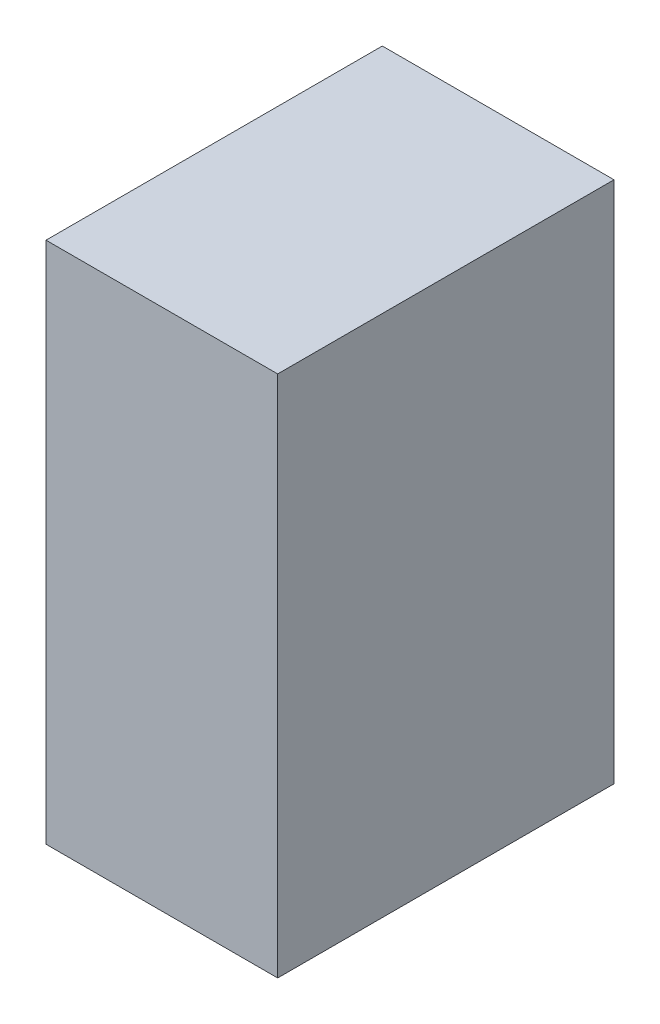
ISO-10303-21;
HEADER;
FILE_DESCRIPTION(('STEP AP214'),'2;1');
FILE_NAME('part.step','',(''),(''),'','','');
FILE_SCHEMA(('AUTOMOTIVE_DESIGN { 1 0 10303 214 1 1 1 1 }'));
ENDSEC;
DATA;
#1=APPLICATION_CONTEXT('core data for automotive mechanical design processes');
#2=APPLICATION_PROTOCOL_DEFINITION('international standard','automotive_design',2000,#1);
#3=PRODUCT_CONTEXT('',#1,'mechanical');
#4=PRODUCT('Part','Part','',(#3));
#5=PRODUCT_RELATED_PRODUCT_CATEGORY('part','',(#4));
#6=PRODUCT_DEFINITION_FORMATION('','',#4);
#7=PRODUCT_DEFINITION_CONTEXT('part definition',#1,'design');
#8=PRODUCT_DEFINITION('design','',#6,#7);
#9=PRODUCT_DEFINITION_SHAPE('','',#8);
#10=(LENGTH_UNIT() NAMED_UNIT(*) SI_UNIT(.MILLI.,.METRE.));
#11=(NAMED_UNIT(*) PLANE_ANGLE_UNIT() SI_UNIT($,.RADIAN.));
#12=(NAMED_UNIT(*) SI_UNIT($,.STERADIAN.) SOLID_ANGLE_UNIT());
#13=UNCERTAINTY_MEASURE_WITH_UNIT(LENGTH_MEASURE(1.E-05),#10,'distance_accuracy_value','');
#14=(GEOMETRIC_REPRESENTATION_CONTEXT(3) GLOBAL_UNCERTAINTY_ASSIGNED_CONTEXT((#13)) GLOBAL_UNIT_ASSIGNED_CONTEXT((#10,
#11,#12)) REPRESENTATION_CONTEXT('',''));
#15=CARTESIAN_POINT('',(0.,0.,0.));
#16=DIRECTION('',(0.,0.,1.));
#17=DIRECTION('',(1.,0.,0.));
#18=AXIS2_PLACEMENT_3D('',#15,#16,#17);
#19=CARTESIAN_POINT('',(19.685,-44.45,28.575));
#20=DIRECTION('',(1.,0.,0.));
#21=DIRECTION('',(0.,0.,-1.));
#22=AXIS2_PLACEMENT_3D('',#19,#20,#21);
#23=PLANE('',#22);
#24=DIRECTION('',(0.,1.,0.));
#25=VECTOR('',#24,1.);
#26=CARTESIAN_POINT('',(19.685,-44.45,-28.575));
#27=LINE('',#26,#25);
#28=CARTESIAN_POINT('',(19.685,-44.45,-28.575));
#29=VERTEX_POINT('',#28);
#30=CARTESIAN_POINT('',(19.685,44.45,-28.575));
#31=VERTEX_POINT('',#30);
#32=EDGE_CURVE('E40',#29,#31,#27,.T.);
#33=ORIENTED_EDGE('',*,*,#32,.T.);
#34=DIRECTION('',(0.,0.,-1.));
#35=VECTOR('',#34,1.);
#36=CARTESIAN_POINT('',(19.685,44.45,28.575));
#37=LINE('',#36,#35);
#38=CARTESIAN_POINT('',(19.685,44.45,28.575));
#39=VERTEX_POINT('',#38);
#40=EDGE_CURVE('E77',#39,#31,#37,.T.);
#41=ORIENTED_EDGE('',*,*,#40,.F.);
#42=DIRECTION('',(0.,1.,0.));
#43=VECTOR('',#42,1.);
#44=CARTESIAN_POINT('',(19.685,-44.45,28.575));
#45=LINE('',#44,#43);
#46=CARTESIAN_POINT('',(19.685,-44.45,28.575));
#47=VERTEX_POINT('',#46);
#48=EDGE_CURVE('E11',#47,#39,#45,.T.);
#49=ORIENTED_EDGE('',*,*,#48,.F.);
#50=DIRECTION('',(0.,0.,-1.));
#51=VECTOR('',#50,1.);
#52=CARTESIAN_POINT('',(19.685,-44.45,28.575));
#53=LINE('',#52,#51);
#54=EDGE_CURVE('E78',#47,#29,#53,.T.);
#55=ORIENTED_EDGE('',*,*,#54,.T.);
#56=EDGE_LOOP('',(#33,#41,#49,#55));
#57=FACE_BOUND('',#56,.T.);
#58=ADVANCED_FACE('F37',(#57),#23,.T.);
#59=CARTESIAN_POINT('',(-19.685,-44.45,28.575));
#60=DIRECTION('',(0.,0.,1.));
#61=DIRECTION('',(1.,0.,0.));
#62=AXIS2_PLACEMENT_3D('',#59,#60,#61);
#63=PLANE('',#62);
#64=ORIENTED_EDGE('',*,*,#48,.T.);
#65=DIRECTION('',(1.,0.,0.));
#66=VECTOR('',#65,1.);
#67=CARTESIAN_POINT('',(-19.685,44.45,28.575));
#68=LINE('',#67,#66);
#69=CARTESIAN_POINT('',(-19.685,44.45,28.575));
#70=VERTEX_POINT('',#69);
#71=EDGE_CURVE('E94',#70,#39,#68,.T.);
#72=ORIENTED_EDGE('',*,*,#71,.F.);
#73=DIRECTION('',(0.,1.,0.));
#74=VECTOR('',#73,1.);
#75=CARTESIAN_POINT('',(-19.685,-44.45,28.575));
#76=LINE('',#75,#74);
#77=CARTESIAN_POINT('',(-19.685,-44.45,28.575));
#78=VERTEX_POINT('',#77);
#79=EDGE_CURVE('E45',#78,#70,#76,.T.);
#80=ORIENTED_EDGE('',*,*,#79,.F.);
#81=DIRECTION('',(1.,0.,0.));
#82=VECTOR('',#81,1.);
#83=CARTESIAN_POINT('',(-19.685,-44.45,28.575));
#84=LINE('',#83,#82);
#85=EDGE_CURVE('E83',#78,#47,#84,.T.);
#86=ORIENTED_EDGE('',*,*,#85,.T.);
#87=EDGE_LOOP('',(#64,#72,#80,#86));
#88=FACE_BOUND('',#87,.T.);
#89=ADVANCED_FACE('F109',(#88),#63,.T.);
#90=CARTESIAN_POINT('',(-19.685,-44.45,28.575));
#91=DIRECTION('',(-1.,0.,0.));
#92=DIRECTION('',(0.,0.,1.));
#93=AXIS2_PLACEMENT_3D('',#90,#91,#92);
#94=PLANE('',#93);
#95=ORIENTED_EDGE('',*,*,#79,.T.);
#96=DIRECTION('',(0.,0.,1.));
#97=VECTOR('',#96,1.);
#98=CARTESIAN_POINT('',(-19.685,44.45,28.575));
#99=LINE('',#98,#97);
#100=CARTESIAN_POINT('',(-19.685,44.45,-28.575));
#101=VERTEX_POINT('',#100);
#102=EDGE_CURVE('E90',#101,#70,#99,.T.);
#103=ORIENTED_EDGE('',*,*,#102,.F.);
#104=DIRECTION('',(0.,1.,0.));
#105=VECTOR('',#104,1.);
#106=CARTESIAN_POINT('',(-19.685,-44.45,-28.575));
#107=LINE('',#106,#105);
#108=CARTESIAN_POINT('',(-19.685,-44.45,-28.575));
#109=VERTEX_POINT('',#108);
#110=EDGE_CURVE('E82',#109,#101,#107,.T.);
#111=ORIENTED_EDGE('',*,*,#110,.F.);
#112=DIRECTION('',(0.,0.,1.));
#113=VECTOR('',#112,1.);
#114=CARTESIAN_POINT('',(-19.685,-44.45,28.575));
#115=LINE('',#114,#113);
#116=EDGE_CURVE('E102',#109,#78,#115,.T.);
#117=ORIENTED_EDGE('',*,*,#116,.T.);
#118=EDGE_LOOP('',(#95,#103,#111,#117));
#119=FACE_BOUND('',#118,.T.);
#120=ADVANCED_FACE('F106',(#119),#94,.T.);
#121=CARTESIAN_POINT('',(-19.685,-44.45,-28.575));
#122=DIRECTION('',(0.,0.,-1.));
#123=DIRECTION('',(-1.,0.,0.));
#124=AXIS2_PLACEMENT_3D('',#121,#122,#123);
#125=PLANE('',#124);
#126=ORIENTED_EDGE('',*,*,#110,.T.);
#127=DIRECTION('',(-1.,0.,0.));
#128=VECTOR('',#127,1.);
#129=CARTESIAN_POINT('',(-19.685,44.45,-28.575));
#130=LINE('',#129,#128);
#131=EDGE_CURVE('E85',#31,#101,#130,.T.);
#132=ORIENTED_EDGE('',*,*,#131,.F.);
#133=ORIENTED_EDGE('',*,*,#32,.F.);
#134=DIRECTION('',(-1.,0.,0.));
#135=VECTOR('',#134,1.);
#136=CARTESIAN_POINT('',(-19.685,-44.45,-28.575));
#137=LINE('',#136,#135);
#138=EDGE_CURVE('E100',#29,#109,#137,.T.);
#139=ORIENTED_EDGE('',*,*,#138,.T.);
#140=EDGE_LOOP('',(#126,#132,#133,#139));
#141=FACE_BOUND('',#140,.T.);
#142=ADVANCED_FACE('F86',(#141),#125,.T.);
#143=CARTESIAN_POINT('',(0.,-44.45,0.));
#144=DIRECTION('',(0.,-1.,0.));
#145=DIRECTION('',(0.,0.,-1.));
#146=AXIS2_PLACEMENT_3D('',#143,#144,#145);
#147=PLANE('',#146);
#148=ORIENTED_EDGE('',*,*,#54,.F.);
#149=ORIENTED_EDGE('',*,*,#85,.F.);
#150=ORIENTED_EDGE('',*,*,#116,.F.);
#151=ORIENTED_EDGE('',*,*,#138,.F.);
#152=EDGE_LOOP('',(#148,#149,#150,#151));
#153=FACE_BOUND('',#152,.T.);
#154=ADVANCED_FACE('F111',(#153),#147,.T.);
#155=CARTESIAN_POINT('',(0.,44.45,0.));
#156=DIRECTION('',(0.,-1.,0.));
#157=DIRECTION('',(0.,0.,-1.));
#158=AXIS2_PLACEMENT_3D('',#155,#156,#157);
#159=PLANE('',#158);
#160=ORIENTED_EDGE('',*,*,#40,.T.);
#161=ORIENTED_EDGE('',*,*,#131,.T.);
#162=ORIENTED_EDGE('',*,*,#102,.T.);
#163=ORIENTED_EDGE('',*,*,#71,.T.);
#164=EDGE_LOOP('',(#160,#161,#162,#163));
#165=FACE_BOUND('',#164,.T.);
#166=ADVANCED_FACE('F93',(#165),#159,.F.);
#167=CLOSED_SHELL('',(#58,#89,#120,#142,#154,#166));
#168=MANIFOLD_SOLID_BREP('B2',#167);
#169=ADVANCED_BREP_SHAPE_REPRESENTATION('',(#18,#168),#14);
#170=SHAPE_DEFINITION_REPRESENTATION(#9,#169);
ENDSEC;
END-ISO-10303-21;
